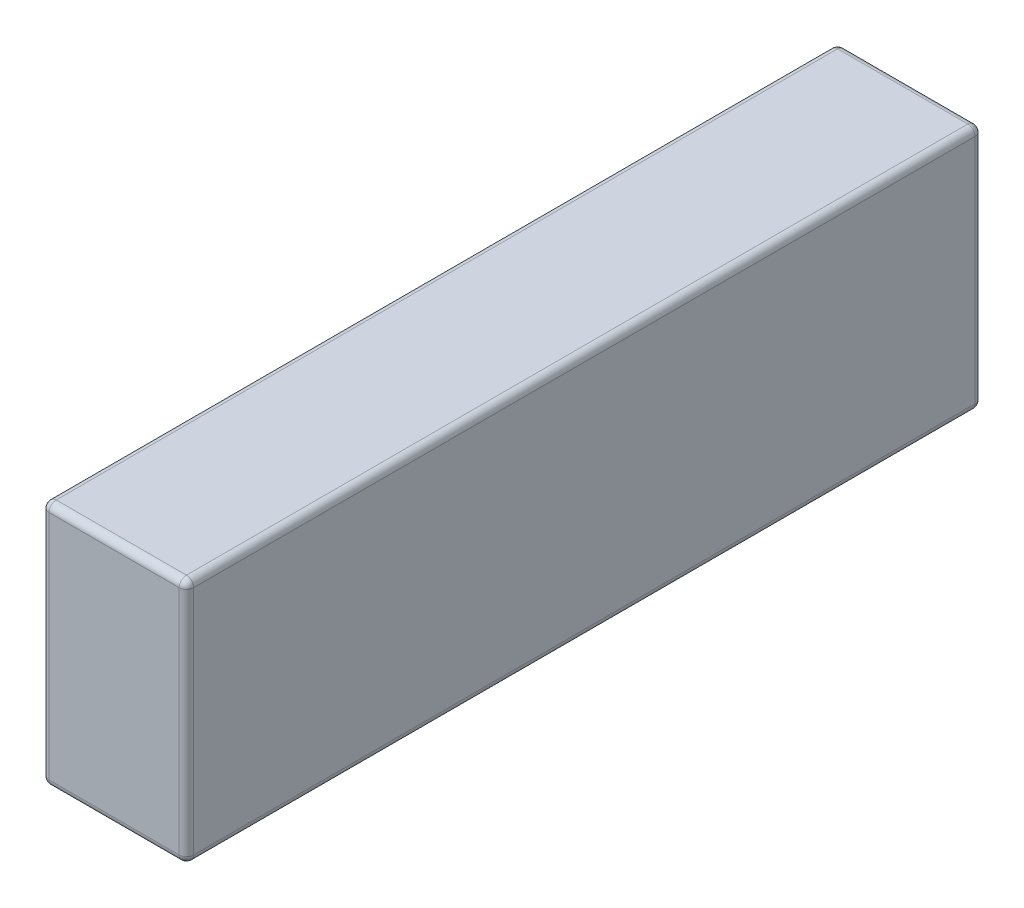
ISO-10303-21;
HEADER;
FILE_DESCRIPTION(('STEP AP214'),'2;1');
FILE_NAME('part.step','',(''),(''),'','','');
FILE_SCHEMA(('AUTOMOTIVE_DESIGN { 1 0 10303 214 1 1 1 1 }'));
ENDSEC;
DATA;
#1=APPLICATION_CONTEXT('core data for automotive mechanical design processes');
#2=APPLICATION_PROTOCOL_DEFINITION('international standard','automotive_design',2000,#1);
#3=PRODUCT_CONTEXT('',#1,'mechanical');
#4=PRODUCT('Part','Part','',(#3));
#5=PRODUCT_RELATED_PRODUCT_CATEGORY('part','',(#4));
#6=PRODUCT_DEFINITION_FORMATION('','',#4);
#7=PRODUCT_DEFINITION_CONTEXT('part definition',#1,'design');
#8=PRODUCT_DEFINITION('design','',#6,#7);
#9=PRODUCT_DEFINITION_SHAPE('','',#8);
#10=(LENGTH_UNIT() NAMED_UNIT(*) SI_UNIT(.MILLI.,.METRE.));
#11=(NAMED_UNIT(*) PLANE_ANGLE_UNIT() SI_UNIT($,.RADIAN.));
#12=(NAMED_UNIT(*) SI_UNIT($,.STERADIAN.) SOLID_ANGLE_UNIT());
#13=UNCERTAINTY_MEASURE_WITH_UNIT(LENGTH_MEASURE(1.E-05),#10,'distance_accuracy_value','');
#14=(GEOMETRIC_REPRESENTATION_CONTEXT(3) GLOBAL_UNCERTAINTY_ASSIGNED_CONTEXT((#13)) GLOBAL_UNIT_ASSIGNED_CONTEXT((#10,
#11,#12)) REPRESENTATION_CONTEXT('',''));
#15=CARTESIAN_POINT('',(0.,0.,0.));
#16=DIRECTION('',(0.,0.,1.));
#17=DIRECTION('',(1.,0.,0.));
#18=AXIS2_PLACEMENT_3D('',#15,#16,#17);
#19=CARTESIAN_POINT('',(-15.,34.,59.5535714285715));
#20=DIRECTION('',(1.,0.,0.));
#21=DIRECTION('',(0.,0.,-1.));
#22=AXIS2_PLACEMENT_3D('',#19,#20,#21);
#23=PLANE('',#22);
#24=DIRECTION('',(0.,0.,1.));
#25=VECTOR('',#24,1.);
#26=CARTESIAN_POINT('',(-15.,33.,-50.4464285714285));
#27=LINE('',#26,#25);
#28=CARTESIAN_POINT('',(-15.,33.,58.5535714285715));
#29=VERTEX_POINT('',#28);
#30=CARTESIAN_POINT('',(-15.,33.,-49.4464285714285));
#31=VERTEX_POINT('',#30);
#32=EDGE_CURVE('E174',#29,#31,#27,.F.);
#33=ORIENTED_EDGE('',*,*,#32,.T.);
#34=DIRECTION('',(0.,-1.,0.));
#35=VECTOR('',#34,1.);
#36=CARTESIAN_POINT('',(-15.,34.,-49.4464285714285));
#37=LINE('',#36,#35);
#38=CARTESIAN_POINT('',(-15.,1.,-49.4464285714285));
#39=VERTEX_POINT('',#38);
#40=EDGE_CURVE('E180',#31,#39,#37,.T.);
#41=ORIENTED_EDGE('',*,*,#40,.T.);
#42=DIRECTION('',(0.,0.,1.));
#43=VECTOR('',#42,1.);
#44=CARTESIAN_POINT('',(-15.,1.,59.5535714285715));
#45=LINE('',#44,#43);
#46=CARTESIAN_POINT('',(-15.,1.,58.5535714285715));
#47=VERTEX_POINT('',#46);
#48=EDGE_CURVE('E178',#39,#47,#45,.T.);
#49=ORIENTED_EDGE('',*,*,#48,.T.);
#50=DIRECTION('',(0.,-1.,0.));
#51=VECTOR('',#50,1.);
#52=CARTESIAN_POINT('',(-15.,34.,58.5535714285715));
#53=LINE('',#52,#51);
#54=EDGE_CURVE('E176',#47,#29,#53,.F.);
#55=ORIENTED_EDGE('',*,*,#54,.T.);
#56=EDGE_LOOP('',(#33,#41,#49,#55));
#57=FACE_BOUND('',#56,.T.);
#58=ADVANCED_FACE('F34',(#57),#23,.F.);
#59=CARTESIAN_POINT('',(5.,34.,59.5535714285715));
#60=DIRECTION('',(0.,0.,-1.));
#61=DIRECTION('',(-1.,0.,0.));
#62=AXIS2_PLACEMENT_3D('',#59,#60,#61);
#63=PLANE('',#62);
#64=DIRECTION('',(1.,0.,0.));
#65=VECTOR('',#64,1.);
#66=CARTESIAN_POINT('',(-15.,33.,59.5535714285715));
#67=LINE('',#66,#65);
#68=CARTESIAN_POINT('',(4.,33.,59.5535714285715));
#69=VERTEX_POINT('',#68);
#70=CARTESIAN_POINT('',(-14.,33.,59.5535714285715));
#71=VERTEX_POINT('',#70);
#72=EDGE_CURVE('E185',#69,#71,#67,.F.);
#73=ORIENTED_EDGE('',*,*,#72,.T.);
#74=DIRECTION('',(0.,-1.,0.));
#75=VECTOR('',#74,1.);
#76=CARTESIAN_POINT('',(-14.,34.,59.5535714285715));
#77=LINE('',#76,#75);
#78=CARTESIAN_POINT('',(-14.,1.,59.5535714285715));
#79=VERTEX_POINT('',#78);
#80=EDGE_CURVE('E189',#71,#79,#77,.T.);
#81=ORIENTED_EDGE('',*,*,#80,.T.);
#82=DIRECTION('',(1.,0.,0.));
#83=VECTOR('',#82,1.);
#84=CARTESIAN_POINT('',(5.,1.,59.5535714285715));
#85=LINE('',#84,#83);
#86=CARTESIAN_POINT('',(4.,1.,59.5535714285715));
#87=VERTEX_POINT('',#86);
#88=EDGE_CURVE('E187',#79,#87,#85,.T.);
#89=ORIENTED_EDGE('',*,*,#88,.T.);
#90=DIRECTION('',(0.,-1.,0.));
#91=VECTOR('',#90,1.);
#92=CARTESIAN_POINT('',(4.,34.,59.5535714285715));
#93=LINE('',#92,#91);
#94=EDGE_CURVE('E183',#87,#69,#93,.F.);
#95=ORIENTED_EDGE('',*,*,#94,.T.);
#96=EDGE_LOOP('',(#73,#81,#89,#95));
#97=FACE_BOUND('',#96,.T.);
#98=ADVANCED_FACE('F273',(#97),#63,.F.);
#99=CARTESIAN_POINT('',(5.,34.,59.5535714285715));
#100=DIRECTION('',(-1.,0.,0.));
#101=DIRECTION('',(0.,0.,1.));
#102=AXIS2_PLACEMENT_3D('',#99,#100,#101);
#103=PLANE('',#102);
#104=DIRECTION('',(0.,0.,-1.));
#105=VECTOR('',#104,1.);
#106=CARTESIAN_POINT('',(5.,33.,59.5535714285715));
#107=LINE('',#106,#105);
#108=CARTESIAN_POINT('',(5.,33.,-49.4464285714285));
#109=VERTEX_POINT('',#108);
#110=CARTESIAN_POINT('',(5.,33.,58.5535714285715));
#111=VERTEX_POINT('',#110);
#112=EDGE_CURVE('E43',#109,#111,#107,.F.);
#113=ORIENTED_EDGE('',*,*,#112,.T.);
#114=DIRECTION('',(0.,-1.,0.));
#115=VECTOR('',#114,1.);
#116=CARTESIAN_POINT('',(5.,34.,58.5535714285715));
#117=LINE('',#116,#115);
#118=CARTESIAN_POINT('',(5.,1.,58.5535714285715));
#119=VERTEX_POINT('',#118);
#120=EDGE_CURVE('E11',#111,#119,#117,.T.);
#121=ORIENTED_EDGE('',*,*,#120,.T.);
#122=DIRECTION('',(0.,0.,-1.));
#123=VECTOR('',#122,1.);
#124=CARTESIAN_POINT('',(5.,1.,59.5535714285715));
#125=LINE('',#124,#123);
#126=CARTESIAN_POINT('',(5.,1.,-49.4464285714285));
#127=VERTEX_POINT('',#126);
#128=EDGE_CURVE('E199',#119,#127,#125,.T.);
#129=ORIENTED_EDGE('',*,*,#128,.T.);
#130=DIRECTION('',(0.,-1.,0.));
#131=VECTOR('',#130,1.);
#132=CARTESIAN_POINT('',(5.,34.,-49.4464285714285));
#133=LINE('',#132,#131);
#134=EDGE_CURVE('E54',#127,#109,#133,.F.);
#135=ORIENTED_EDGE('',*,*,#134,.T.);
#136=EDGE_LOOP('',(#113,#121,#129,#135));
#137=FACE_BOUND('',#136,.T.);
#138=ADVANCED_FACE('F286',(#137),#103,.F.);
#139=CARTESIAN_POINT('',(5.,34.,-50.4464285714285));
#140=DIRECTION('',(0.,0.,1.));
#141=DIRECTION('',(1.,0.,0.));
#142=AXIS2_PLACEMENT_3D('',#139,#140,#141);
#143=PLANE('',#142);
#144=DIRECTION('',(0.,-1.,0.));
#145=VECTOR('',#144,1.);
#146=CARTESIAN_POINT('',(4.,34.,-50.4464285714285));
#147=LINE('',#146,#145);
#148=CARTESIAN_POINT('',(4.,33.,-50.4464285714285));
#149=VERTEX_POINT('',#148);
#150=CARTESIAN_POINT('',(4.,1.,-50.4464285714285));
#151=VERTEX_POINT('',#150);
#152=EDGE_CURVE('E126',#149,#151,#147,.T.);
#153=ORIENTED_EDGE('',*,*,#152,.T.);
#154=DIRECTION('',(-1.,0.,0.));
#155=VECTOR('',#154,1.);
#156=CARTESIAN_POINT('',(5.,1.,-50.4464285714285));
#157=LINE('',#156,#155);
#158=CARTESIAN_POINT('',(-14.,1.,-50.4464285714285));
#159=VERTEX_POINT('',#158);
#160=EDGE_CURVE('E163',#151,#159,#157,.T.);
#161=ORIENTED_EDGE('',*,*,#160,.T.);
#162=DIRECTION('',(0.,-1.,0.));
#163=VECTOR('',#162,1.);
#164=CARTESIAN_POINT('',(-14.,34.,-50.4464285714285));
#165=LINE('',#164,#163);
#166=CARTESIAN_POINT('',(-14.,33.,-50.4464285714285));
#167=VERTEX_POINT('',#166);
#168=EDGE_CURVE('E129',#159,#167,#165,.F.);
#169=ORIENTED_EDGE('',*,*,#168,.T.);
#170=DIRECTION('',(-1.,0.,0.));
#171=VECTOR('',#170,1.);
#172=CARTESIAN_POINT('',(5.,33.,-50.4464285714285));
#173=LINE('',#172,#171);
#174=EDGE_CURVE('E121',#167,#149,#173,.F.);
#175=ORIENTED_EDGE('',*,*,#174,.T.);
#176=EDGE_LOOP('',(#153,#161,#169,#175));
#177=FACE_BOUND('',#176,.T.);
#178=ADVANCED_FACE('F123',(#177),#143,.F.);
#179=CARTESIAN_POINT('',(0.,34.,0.));
#180=DIRECTION('',(0.,1.,0.));
#181=DIRECTION('',(0.,0.,1.));
#182=AXIS2_PLACEMENT_3D('',#179,#180,#181);
#183=PLANE('',#182);
#184=DIRECTION('',(-1.,0.,0.));
#185=VECTOR('',#184,1.);
#186=CARTESIAN_POINT('',(-15.,34.,-49.4464285714285));
#187=LINE('',#186,#185);
#188=CARTESIAN_POINT('',(4.,34.,-49.4464285714285));
#189=VERTEX_POINT('',#188);
#190=CARTESIAN_POINT('',(-14.,34.,-49.4464285714285));
#191=VERTEX_POINT('',#190);
#192=EDGE_CURVE('E140',#189,#191,#187,.T.);
#193=ORIENTED_EDGE('',*,*,#192,.T.);
#194=DIRECTION('',(0.,0.,1.));
#195=VECTOR('',#194,1.);
#196=CARTESIAN_POINT('',(-14.,34.,59.5535714285715));
#197=LINE('',#196,#195);
#198=CARTESIAN_POINT('',(-14.,34.,58.5535714285715));
#199=VERTEX_POINT('',#198);
#200=EDGE_CURVE('E197',#191,#199,#197,.T.);
#201=ORIENTED_EDGE('',*,*,#200,.T.);
#202=DIRECTION('',(1.,0.,0.));
#203=VECTOR('',#202,1.);
#204=CARTESIAN_POINT('',(5.,34.,58.5535714285715));
#205=LINE('',#204,#203);
#206=CARTESIAN_POINT('',(4.,34.,58.5535714285715));
#207=VERTEX_POINT('',#206);
#208=EDGE_CURVE('E194',#199,#207,#205,.T.);
#209=ORIENTED_EDGE('',*,*,#208,.T.);
#210=DIRECTION('',(0.,0.,-1.));
#211=VECTOR('',#210,1.);
#212=CARTESIAN_POINT('',(4.,34.,-50.4464285714285));
#213=LINE('',#212,#211);
#214=EDGE_CURVE('E192',#207,#189,#213,.T.);
#215=ORIENTED_EDGE('',*,*,#214,.T.);
#216=EDGE_LOOP('',(#193,#201,#209,#215));
#217=FACE_BOUND('',#216,.T.);
#218=ADVANCED_FACE('F478',(#217),#183,.T.);
#219=CARTESIAN_POINT('',(0.,0.,0.));
#220=DIRECTION('',(0.,1.,0.));
#221=DIRECTION('',(0.,0.,1.));
#222=AXIS2_PLACEMENT_3D('',#219,#220,#221);
#223=PLANE('',#222);
#224=DIRECTION('',(0.,0.,1.));
#225=VECTOR('',#224,1.);
#226=CARTESIAN_POINT('',(-14.,0.,0.));
#227=LINE('',#226,#225);
#228=CARTESIAN_POINT('',(-14.,0.,58.5535714285715));
#229=VERTEX_POINT('',#228);
#230=CARTESIAN_POINT('',(-14.,0.,-49.4464285714285));
#231=VERTEX_POINT('',#230);
#232=EDGE_CURVE('E169',#229,#231,#227,.F.);
#233=ORIENTED_EDGE('',*,*,#232,.T.);
#234=DIRECTION('',(-1.,0.,0.));
#235=VECTOR('',#234,1.);
#236=CARTESIAN_POINT('',(0.,0.,-49.4464285714285));
#237=LINE('',#236,#235);
#238=CARTESIAN_POINT('',(4.,0.,-49.4464285714285));
#239=VERTEX_POINT('',#238);
#240=EDGE_CURVE('E171',#231,#239,#237,.F.);
#241=ORIENTED_EDGE('',*,*,#240,.T.);
#242=DIRECTION('',(0.,0.,-1.));
#243=VECTOR('',#242,1.);
#244=CARTESIAN_POINT('',(4.,0.,0.));
#245=LINE('',#244,#243);
#246=CARTESIAN_POINT('',(4.,0.,58.5535714285715));
#247=VERTEX_POINT('',#246);
#248=EDGE_CURVE('E165',#239,#247,#245,.F.);
#249=ORIENTED_EDGE('',*,*,#248,.T.);
#250=DIRECTION('',(1.,0.,0.));
#251=VECTOR('',#250,1.);
#252=CARTESIAN_POINT('',(0.,0.,58.5535714285715));
#253=LINE('',#252,#251);
#254=EDGE_CURVE('E167',#247,#229,#253,.F.);
#255=ORIENTED_EDGE('',*,*,#254,.T.);
#256=EDGE_LOOP('',(#233,#241,#249,#255));
#257=FACE_BOUND('',#256,.T.);
#258=ADVANCED_FACE('F471',(#257),#223,.F.);
#259=CARTESIAN_POINT('',(0.,33.,58.5535714285715));
#260=DIRECTION('',(-1.,0.,0.));
#261=DIRECTION('',(0.,0.,1.));
#262=AXIS2_PLACEMENT_3D('',#259,#260,#261);
#263=CYLINDRICAL_SURFACE('',#262,1.);
#264=CARTESIAN_POINT('',(4.,33.,58.5535714285715));
#265=DIRECTION('',(1.,0.,0.));
#266=DIRECTION('',(0.,0.,-1.));
#267=AXIS2_PLACEMENT_3D('',#264,#265,#266);
#268=CIRCLE('',#267,1.);
#269=EDGE_CURVE('E38',#207,#69,#268,.T.);
#270=ORIENTED_EDGE('',*,*,#269,.F.);
#271=ORIENTED_EDGE('',*,*,#208,.F.);
#272=CARTESIAN_POINT('',(-14.,33.,58.5535714285715));
#273=DIRECTION('',(-1.,0.,0.));
#274=DIRECTION('',(0.,0.,1.));
#275=AXIS2_PLACEMENT_3D('',#272,#273,#274);
#276=CIRCLE('',#275,1.);
#277=EDGE_CURVE('E160',#71,#199,#276,.T.);
#278=ORIENTED_EDGE('',*,*,#277,.F.);
#279=ORIENTED_EDGE('',*,*,#72,.F.);
#280=EDGE_LOOP('',(#270,#271,#278,#279));
#281=FACE_BOUND('',#280,.T.);
#282=ADVANCED_FACE('F36',(#281),#263,.T.);
#283=CARTESIAN_POINT('',(4.,33.,58.5535714285715));
#284=DIRECTION('',(0.,0.,1.));
#285=DIRECTION('',(1.,0.,0.));
#286=AXIS2_PLACEMENT_3D('',#283,#284,#285);
#287=SPHERICAL_SURFACE('',#286,1.);
#288=CARTESIAN_POINT('',(4.,33.,58.5535714285715));
#289=DIRECTION('',(0.,0.,1.));
#290=DIRECTION('',(0.,-1.,0.));
#291=AXIS2_PLACEMENT_3D('',#288,#289,#290);
#292=CIRCLE('',#291,1.);
#293=EDGE_CURVE('E244',#207,#111,#292,.F.);
#294=ORIENTED_EDGE('',*,*,#293,.F.);
#295=ORIENTED_EDGE('',*,*,#269,.T.);
#296=CARTESIAN_POINT('',(4.,33.,58.5535714285715));
#297=DIRECTION('',(0.,1.,0.));
#298=DIRECTION('',(0.,0.,1.));
#299=AXIS2_PLACEMENT_3D('',#296,#297,#298);
#300=CIRCLE('',#299,1.);
#301=EDGE_CURVE('E246',#111,#69,#300,.F.);
#302=ORIENTED_EDGE('',*,*,#301,.F.);
#303=EDGE_LOOP('',(#294,#295,#302));
#304=FACE_BOUND('',#303,.T.);
#305=ADVANCED_FACE('F279',(#304),#287,.T.);
#306=CARTESIAN_POINT('',(-14.,33.,58.5535714285715));
#307=DIRECTION('',(0.,0.,1.));
#308=DIRECTION('',(1.,0.,0.));
#309=AXIS2_PLACEMENT_3D('',#306,#307,#308);
#310=SPHERICAL_SURFACE('',#309,1.);
#311=CARTESIAN_POINT('',(-14.,33.,58.5535714285715));
#312=DIRECTION('',(0.,1.,0.));
#313=DIRECTION('',(0.,0.,1.));
#314=AXIS2_PLACEMENT_3D('',#311,#312,#313);
#315=CIRCLE('',#314,1.);
#316=EDGE_CURVE('E238',#71,#29,#315,.F.);
#317=ORIENTED_EDGE('',*,*,#316,.F.);
#318=ORIENTED_EDGE('',*,*,#277,.T.);
#319=CARTESIAN_POINT('',(-14.,33.,58.5535714285715));
#320=DIRECTION('',(0.,0.,1.));
#321=DIRECTION('',(1.,0.,0.));
#322=AXIS2_PLACEMENT_3D('',#319,#320,#321);
#323=CIRCLE('',#322,1.);
#324=EDGE_CURVE('E241',#29,#199,#323,.F.);
#325=ORIENTED_EDGE('',*,*,#324,.F.);
#326=EDGE_LOOP('',(#317,#318,#325));
#327=FACE_BOUND('',#326,.T.);
#328=ADVANCED_FACE('F253',(#327),#310,.T.);
#329=CARTESIAN_POINT('',(4.,34.,58.5535714285715));
#330=DIRECTION('',(0.,-1.,0.));
#331=DIRECTION('',(0.,0.,-1.));
#332=AXIS2_PLACEMENT_3D('',#329,#330,#331);
#333=CYLINDRICAL_SURFACE('',#332,1.);
#334=ORIENTED_EDGE('',*,*,#301,.T.);
#335=ORIENTED_EDGE('',*,*,#94,.F.);
#336=CARTESIAN_POINT('',(4.,1.,58.5535714285715));
#337=DIRECTION('',(0.,-1.,0.));
#338=DIRECTION('',(0.,0.,-1.));
#339=AXIS2_PLACEMENT_3D('',#336,#337,#338);
#340=CIRCLE('',#339,1.);
#341=EDGE_CURVE('E232',#119,#87,#340,.T.);
#342=ORIENTED_EDGE('',*,*,#341,.F.);
#343=ORIENTED_EDGE('',*,*,#120,.F.);
#344=EDGE_LOOP('',(#334,#335,#342,#343));
#345=FACE_BOUND('',#344,.T.);
#346=ADVANCED_FACE('F283',(#345),#333,.T.);
#347=CARTESIAN_POINT('',(4.,33.,0.));
#348=DIRECTION('',(0.,0.,1.));
#349=DIRECTION('',(1.,0.,0.));
#350=AXIS2_PLACEMENT_3D('',#347,#348,#349);
#351=CYLINDRICAL_SURFACE('',#350,1.);
#352=ORIENTED_EDGE('',*,*,#293,.T.);
#353=ORIENTED_EDGE('',*,*,#112,.F.);
#354=CARTESIAN_POINT('',(4.,33.,-49.4464285714285));
#355=DIRECTION('',(0.,0.,-1.));
#356=DIRECTION('',(-1.,0.,0.));
#357=AXIS2_PLACEMENT_3D('',#354,#355,#356);
#358=CIRCLE('',#357,1.);
#359=EDGE_CURVE('E144',#189,#109,#358,.T.);
#360=ORIENTED_EDGE('',*,*,#359,.F.);
#361=ORIENTED_EDGE('',*,*,#214,.F.);
#362=EDGE_LOOP('',(#352,#353,#360,#361));
#363=FACE_BOUND('',#362,.T.);
#364=ADVANCED_FACE('F435',(#363),#351,.T.);
#365=CARTESIAN_POINT('',(0.,33.,-49.4464285714285));
#366=DIRECTION('',(1.,0.,0.));
#367=DIRECTION('',(0.,0.,-1.));
#368=AXIS2_PLACEMENT_3D('',#365,#366,#367);
#369=CYLINDRICAL_SURFACE('',#368,1.);
#370=CARTESIAN_POINT('',(-14.,33.,-49.4464285714285));
#371=DIRECTION('',(-1.,0.,0.));
#372=DIRECTION('',(0.,0.,1.));
#373=AXIS2_PLACEMENT_3D('',#370,#371,#372);
#374=CIRCLE('',#373,1.);
#375=EDGE_CURVE('E145',#191,#167,#374,.T.);
#376=ORIENTED_EDGE('',*,*,#375,.F.);
#377=ORIENTED_EDGE('',*,*,#192,.F.);
#378=CARTESIAN_POINT('',(4.,33.,-49.4464285714285));
#379=DIRECTION('',(1.,0.,0.));
#380=DIRECTION('',(0.,0.,-1.));
#381=AXIS2_PLACEMENT_3D('',#378,#379,#380);
#382=CIRCLE('',#381,1.);
#383=EDGE_CURVE('E136',#149,#189,#382,.T.);
#384=ORIENTED_EDGE('',*,*,#383,.F.);
#385=ORIENTED_EDGE('',*,*,#174,.F.);
#386=EDGE_LOOP('',(#376,#377,#384,#385));
#387=FACE_BOUND('',#386,.T.);
#388=ADVANCED_FACE('F138',(#387),#369,.T.);
#389=CARTESIAN_POINT('',(-14.,33.,0.));
#390=DIRECTION('',(0.,0.,-1.));
#391=DIRECTION('',(-1.,0.,0.));
#392=AXIS2_PLACEMENT_3D('',#389,#390,#391);
#393=CYLINDRICAL_SURFACE('',#392,1.);
#394=ORIENTED_EDGE('',*,*,#324,.T.);
#395=ORIENTED_EDGE('',*,*,#200,.F.);
#396=CARTESIAN_POINT('',(-14.,33.,-49.4464285714285));
#397=DIRECTION('',(0.,0.,-1.));
#398=DIRECTION('',(-1.,0.,0.));
#399=AXIS2_PLACEMENT_3D('',#396,#397,#398);
#400=CIRCLE('',#399,1.);
#401=EDGE_CURVE('E228',#31,#191,#400,.T.);
#402=ORIENTED_EDGE('',*,*,#401,.F.);
#403=ORIENTED_EDGE('',*,*,#32,.F.);
#404=EDGE_LOOP('',(#394,#395,#402,#403));
#405=FACE_BOUND('',#404,.T.);
#406=ADVANCED_FACE('F261',(#405),#393,.T.);
#407=CARTESIAN_POINT('',(-14.,34.,58.5535714285715));
#408=DIRECTION('',(0.,-1.,0.));
#409=DIRECTION('',(0.,0.,-1.));
#410=AXIS2_PLACEMENT_3D('',#407,#408,#409);
#411=CYLINDRICAL_SURFACE('',#410,1.);
#412=ORIENTED_EDGE('',*,*,#316,.T.);
#413=ORIENTED_EDGE('',*,*,#54,.F.);
#414=CARTESIAN_POINT('',(-14.,1.,58.5535714285715));
#415=DIRECTION('',(0.,-1.,0.));
#416=DIRECTION('',(0.,0.,-1.));
#417=AXIS2_PLACEMENT_3D('',#414,#415,#416);
#418=CIRCLE('',#417,1.);
#419=EDGE_CURVE('E225',#79,#47,#418,.T.);
#420=ORIENTED_EDGE('',*,*,#419,.F.);
#421=ORIENTED_EDGE('',*,*,#80,.F.);
#422=EDGE_LOOP('',(#412,#413,#420,#421));
#423=FACE_BOUND('',#422,.T.);
#424=ADVANCED_FACE('F270',(#423),#411,.T.);
#425=CARTESIAN_POINT('',(5.,1.,58.5535714285715));
#426=DIRECTION('',(1.,0.,0.));
#427=DIRECTION('',(0.,0.,-1.));
#428=AXIS2_PLACEMENT_3D('',#425,#426,#427);
#429=CYLINDRICAL_SURFACE('',#428,1.);
#430=CARTESIAN_POINT('',(4.,1.,58.5535714285715));
#431=DIRECTION('',(1.,0.,0.));
#432=DIRECTION('',(0.,0.,-1.));
#433=AXIS2_PLACEMENT_3D('',#430,#431,#432);
#434=CIRCLE('',#433,1.);
#435=EDGE_CURVE('E235',#87,#247,#434,.T.);
#436=ORIENTED_EDGE('',*,*,#435,.F.);
#437=ORIENTED_EDGE('',*,*,#88,.F.);
#438=CARTESIAN_POINT('',(-14.,1.,58.5535714285715));
#439=DIRECTION('',(-1.,0.,0.));
#440=DIRECTION('',(0.,0.,1.));
#441=AXIS2_PLACEMENT_3D('',#438,#439,#440);
#442=CIRCLE('',#441,1.);
#443=EDGE_CURVE('E223',#229,#79,#442,.T.);
#444=ORIENTED_EDGE('',*,*,#443,.F.);
#445=ORIENTED_EDGE('',*,*,#254,.F.);
#446=EDGE_LOOP('',(#436,#437,#444,#445));
#447=FACE_BOUND('',#446,.T.);
#448=ADVANCED_FACE('F404',(#447),#429,.T.);
#449=CARTESIAN_POINT('',(4.,1.,58.5535714285715));
#450=DIRECTION('',(0.,0.,1.));
#451=DIRECTION('',(1.,0.,0.));
#452=AXIS2_PLACEMENT_3D('',#449,#450,#451);
#453=SPHERICAL_SURFACE('',#452,1.);
#454=ORIENTED_EDGE('',*,*,#341,.T.);
#455=ORIENTED_EDGE('',*,*,#435,.T.);
#456=CARTESIAN_POINT('',(4.,1.,58.5535714285715));
#457=DIRECTION('',(0.,0.,1.));
#458=DIRECTION('',(1.,0.,0.));
#459=AXIS2_PLACEMENT_3D('',#456,#457,#458);
#460=CIRCLE('',#459,1.);
#461=EDGE_CURVE('E151',#119,#247,#460,.F.);
#462=ORIENTED_EDGE('',*,*,#461,.F.);
#463=EDGE_LOOP('',(#454,#455,#462));
#464=FACE_BOUND('',#463,.T.);
#465=ADVANCED_FACE('F316',(#464),#453,.T.);
#466=CARTESIAN_POINT('',(4.,33.,-49.4464285714285));
#467=DIRECTION('',(0.,0.,1.));
#468=DIRECTION('',(1.,0.,0.));
#469=AXIS2_PLACEMENT_3D('',#466,#467,#468);
#470=SPHERICAL_SURFACE('',#469,1.);
#471=ORIENTED_EDGE('',*,*,#383,.T.);
#472=ORIENTED_EDGE('',*,*,#359,.T.);
#473=CARTESIAN_POINT('',(4.,33.,-49.4464285714285));
#474=DIRECTION('',(0.,1.,0.));
#475=DIRECTION('',(0.,0.,1.));
#476=AXIS2_PLACEMENT_3D('',#473,#474,#475);
#477=CIRCLE('',#476,1.);
#478=EDGE_CURVE('E148',#149,#109,#477,.F.);
#479=ORIENTED_EDGE('',*,*,#478,.F.);
#480=EDGE_LOOP('',(#471,#472,#479));
#481=FACE_BOUND('',#480,.T.);
#482=ADVANCED_FACE('F149',(#481),#470,.T.);
#483=CARTESIAN_POINT('',(-14.,33.,-49.4464285714285));
#484=DIRECTION('',(0.,0.,1.));
#485=DIRECTION('',(1.,0.,0.));
#486=AXIS2_PLACEMENT_3D('',#483,#484,#485);
#487=SPHERICAL_SURFACE('',#486,1.);
#488=ORIENTED_EDGE('',*,*,#401,.T.);
#489=ORIENTED_EDGE('',*,*,#375,.T.);
#490=CARTESIAN_POINT('',(-14.,33.,-49.4464285714285));
#491=DIRECTION('',(0.,1.,0.));
#492=DIRECTION('',(0.,0.,1.));
#493=AXIS2_PLACEMENT_3D('',#490,#491,#492);
#494=CIRCLE('',#493,1.);
#495=EDGE_CURVE('E152',#31,#167,#494,.F.);
#496=ORIENTED_EDGE('',*,*,#495,.F.);
#497=EDGE_LOOP('',(#488,#489,#496));
#498=FACE_BOUND('',#497,.T.);
#499=ADVANCED_FACE('F306',(#498),#487,.T.);
#500=CARTESIAN_POINT('',(-14.,1.,58.5535714285715));
#501=DIRECTION('',(0.,0.,1.));
#502=DIRECTION('',(1.,0.,0.));
#503=AXIS2_PLACEMENT_3D('',#500,#501,#502);
#504=SPHERICAL_SURFACE('',#503,1.);
#505=ORIENTED_EDGE('',*,*,#443,.T.);
#506=ORIENTED_EDGE('',*,*,#419,.T.);
#507=CARTESIAN_POINT('',(-14.,1.,58.5535714285715));
#508=DIRECTION('',(0.,0.,1.));
#509=DIRECTION('',(1.,0.,0.));
#510=AXIS2_PLACEMENT_3D('',#507,#508,#509);
#511=CIRCLE('',#510,1.);
#512=EDGE_CURVE('E216',#229,#47,#511,.F.);
#513=ORIENTED_EDGE('',*,*,#512,.F.);
#514=EDGE_LOOP('',(#505,#506,#513));
#515=FACE_BOUND('',#514,.T.);
#516=ADVANCED_FACE('F308',(#515),#504,.T.);
#517=CARTESIAN_POINT('',(4.,1.,59.5535714285715));
#518=DIRECTION('',(0.,0.,-1.));
#519=DIRECTION('',(-1.,0.,0.));
#520=AXIS2_PLACEMENT_3D('',#517,#518,#519);
#521=CYLINDRICAL_SURFACE('',#520,1.);
#522=ORIENTED_EDGE('',*,*,#461,.T.);
#523=ORIENTED_EDGE('',*,*,#248,.F.);
#524=CARTESIAN_POINT('',(4.,1.,-49.4464285714285));
#525=DIRECTION('',(0.,0.,-1.));
#526=DIRECTION('',(-1.,0.,0.));
#527=AXIS2_PLACEMENT_3D('',#524,#525,#526);
#528=CIRCLE('',#527,1.);
#529=EDGE_CURVE('E213',#127,#239,#528,.T.);
#530=ORIENTED_EDGE('',*,*,#529,.F.);
#531=ORIENTED_EDGE('',*,*,#128,.F.);
#532=EDGE_LOOP('',(#522,#523,#530,#531));
#533=FACE_BOUND('',#532,.T.);
#534=ADVANCED_FACE('F291',(#533),#521,.T.);
#535=CARTESIAN_POINT('',(4.,34.,-49.4464285714285));
#536=DIRECTION('',(0.,-1.,0.));
#537=DIRECTION('',(0.,0.,-1.));
#538=AXIS2_PLACEMENT_3D('',#535,#536,#537);
#539=CYLINDRICAL_SURFACE('',#538,1.);
#540=ORIENTED_EDGE('',*,*,#478,.T.);
#541=ORIENTED_EDGE('',*,*,#134,.F.);
#542=CARTESIAN_POINT('',(4.,1.,-49.4464285714285));
#543=DIRECTION('',(0.,-1.,0.));
#544=DIRECTION('',(0.,0.,-1.));
#545=AXIS2_PLACEMENT_3D('',#542,#543,#544);
#546=CIRCLE('',#545,1.);
#547=EDGE_CURVE('E156',#151,#127,#546,.T.);
#548=ORIENTED_EDGE('',*,*,#547,.F.);
#549=ORIENTED_EDGE('',*,*,#152,.F.);
#550=EDGE_LOOP('',(#540,#541,#548,#549));
#551=FACE_BOUND('',#550,.T.);
#552=ADVANCED_FACE('F154',(#551),#539,.T.);
#553=CARTESIAN_POINT('',(-14.,34.,-49.4464285714285));
#554=DIRECTION('',(0.,-1.,0.));
#555=DIRECTION('',(0.,0.,-1.));
#556=AXIS2_PLACEMENT_3D('',#553,#554,#555);
#557=CYLINDRICAL_SURFACE('',#556,1.);
#558=ORIENTED_EDGE('',*,*,#495,.T.);
#559=ORIENTED_EDGE('',*,*,#168,.F.);
#560=CARTESIAN_POINT('',(-14.,1.,-49.4464285714285));
#561=DIRECTION('',(0.,-1.,0.));
#562=DIRECTION('',(0.,0.,-1.));
#563=AXIS2_PLACEMENT_3D('',#560,#561,#562);
#564=CIRCLE('',#563,1.);
#565=EDGE_CURVE('E209',#39,#159,#564,.T.);
#566=ORIENTED_EDGE('',*,*,#565,.F.);
#567=ORIENTED_EDGE('',*,*,#40,.F.);
#568=EDGE_LOOP('',(#558,#559,#566,#567));
#569=FACE_BOUND('',#568,.T.);
#570=ADVANCED_FACE('F304',(#569),#557,.T.);
#571=CARTESIAN_POINT('',(-14.,1.,59.5535714285715));
#572=DIRECTION('',(0.,0.,1.));
#573=DIRECTION('',(1.,0.,0.));
#574=AXIS2_PLACEMENT_3D('',#571,#572,#573);
#575=CYLINDRICAL_SURFACE('',#574,1.);
#576=ORIENTED_EDGE('',*,*,#512,.T.);
#577=ORIENTED_EDGE('',*,*,#48,.F.);
#578=CARTESIAN_POINT('',(-14.,1.,-49.4464285714285));
#579=DIRECTION('',(0.,0.,-1.));
#580=DIRECTION('',(-1.,0.,0.));
#581=AXIS2_PLACEMENT_3D('',#578,#579,#580);
#582=CIRCLE('',#581,1.);
#583=EDGE_CURVE('E207',#231,#39,#582,.T.);
#584=ORIENTED_EDGE('',*,*,#583,.F.);
#585=ORIENTED_EDGE('',*,*,#232,.F.);
#586=EDGE_LOOP('',(#576,#577,#584,#585));
#587=FACE_BOUND('',#586,.T.);
#588=ADVANCED_FACE('F332',(#587),#575,.T.);
#589=CARTESIAN_POINT('',(4.,1.,-49.4464285714285));
#590=DIRECTION('',(0.,0.,1.));
#591=DIRECTION('',(1.,0.,0.));
#592=AXIS2_PLACEMENT_3D('',#589,#590,#591);
#593=SPHERICAL_SURFACE('',#592,1.);
#594=ORIENTED_EDGE('',*,*,#547,.T.);
#595=ORIENTED_EDGE('',*,*,#529,.T.);
#596=CARTESIAN_POINT('',(4.,1.,-49.4464285714285));
#597=DIRECTION('',(1.,0.,0.));
#598=DIRECTION('',(0.,0.,-1.));
#599=AXIS2_PLACEMENT_3D('',#596,#597,#598);
#600=CIRCLE('',#599,1.);
#601=EDGE_CURVE('E205',#151,#239,#600,.F.);
#602=ORIENTED_EDGE('',*,*,#601,.F.);
#603=EDGE_LOOP('',(#594,#595,#602));
#604=FACE_BOUND('',#603,.T.);
#605=ADVANCED_FACE('F293',(#604),#593,.T.);
#606=CARTESIAN_POINT('',(-14.,1.,-49.4464285714285));
#607=DIRECTION('',(0.,0.,1.));
#608=DIRECTION('',(1.,0.,0.));
#609=AXIS2_PLACEMENT_3D('',#606,#607,#608);
#610=SPHERICAL_SURFACE('',#609,1.);
#611=ORIENTED_EDGE('',*,*,#583,.T.);
#612=ORIENTED_EDGE('',*,*,#565,.T.);
#613=CARTESIAN_POINT('',(-14.,1.,-49.4464285714285));
#614=DIRECTION('',(-1.,0.,0.));
#615=DIRECTION('',(0.,0.,1.));
#616=AXIS2_PLACEMENT_3D('',#613,#614,#615);
#617=CIRCLE('',#616,1.);
#618=EDGE_CURVE('E203',#231,#159,#617,.F.);
#619=ORIENTED_EDGE('',*,*,#618,.F.);
#620=EDGE_LOOP('',(#611,#612,#619));
#621=FACE_BOUND('',#620,.T.);
#622=ADVANCED_FACE('F301',(#621),#610,.T.);
#623=CARTESIAN_POINT('',(5.,1.,-49.4464285714285));
#624=DIRECTION('',(-1.,0.,0.));
#625=DIRECTION('',(0.,0.,1.));
#626=AXIS2_PLACEMENT_3D('',#623,#624,#625);
#627=CYLINDRICAL_SURFACE('',#626,1.);
#628=ORIENTED_EDGE('',*,*,#601,.T.);
#629=ORIENTED_EDGE('',*,*,#240,.F.);
#630=ORIENTED_EDGE('',*,*,#618,.T.);
#631=ORIENTED_EDGE('',*,*,#160,.F.);
#632=EDGE_LOOP('',(#628,#629,#630,#631));
#633=FACE_BOUND('',#632,.T.);
#634=ADVANCED_FACE('F297',(#633),#627,.T.);
#635=CLOSED_SHELL('',(#58,#98,#138,#178,#218,#258,#282,#305,#328,#346,#364,#388,#406,#424,#448,
#465,#482,#499,#516,#534,#552,#570,#588,#605,#622,#634));
#636=MANIFOLD_SOLID_BREP('B2',#635);
#637=ADVANCED_BREP_SHAPE_REPRESENTATION('',(#18,#636),#14);
#638=SHAPE_DEFINITION_REPRESENTATION(#9,#637);
ENDSEC;
END-ISO-10303-21;
